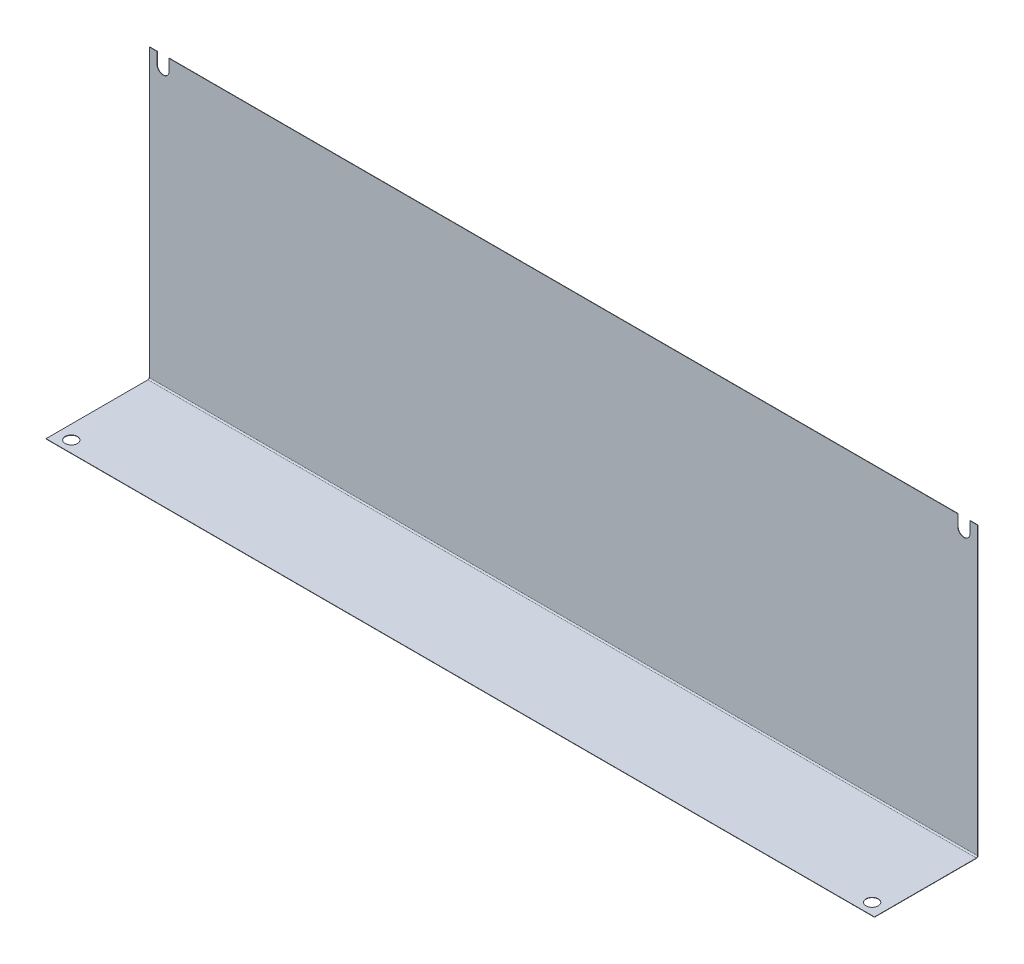
ISO-10303-21;
HEADER;
FILE_DESCRIPTION(('STEP AP214'),'2;1');
FILE_NAME('part.step','',(''),(''),'','','');
FILE_SCHEMA(('AUTOMOTIVE_DESIGN { 1 0 10303 214 1 1 1 1 }'));
ENDSEC;
DATA;
#1=APPLICATION_CONTEXT('core data for automotive mechanical design processes');
#2=APPLICATION_PROTOCOL_DEFINITION('international standard','automotive_design',2000,#1);
#3=PRODUCT_CONTEXT('',#1,'mechanical');
#4=PRODUCT('Part','Part','',(#3));
#5=PRODUCT_RELATED_PRODUCT_CATEGORY('part','',(#4));
#6=PRODUCT_DEFINITION_FORMATION('','',#4);
#7=PRODUCT_DEFINITION_CONTEXT('part definition',#1,'design');
#8=PRODUCT_DEFINITION('design','',#6,#7);
#9=PRODUCT_DEFINITION_SHAPE('','',#8);
#10=(LENGTH_UNIT() NAMED_UNIT(*) SI_UNIT(.MILLI.,.METRE.));
#11=(NAMED_UNIT(*) PLANE_ANGLE_UNIT() SI_UNIT($,.RADIAN.));
#12=(NAMED_UNIT(*) SI_UNIT($,.STERADIAN.) SOLID_ANGLE_UNIT());
#13=UNCERTAINTY_MEASURE_WITH_UNIT(LENGTH_MEASURE(1.E-05),#10,'distance_accuracy_value','');
#14=(GEOMETRIC_REPRESENTATION_CONTEXT(3) GLOBAL_UNCERTAINTY_ASSIGNED_CONTEXT((#13)) GLOBAL_UNIT_ASSIGNED_CONTEXT((#10,
#11,#12)) REPRESENTATION_CONTEXT('',''));
#15=CARTESIAN_POINT('',(0.,0.,0.));
#16=DIRECTION('',(0.,0.,1.));
#17=DIRECTION('',(1.,0.,0.));
#18=AXIS2_PLACEMENT_3D('',#15,#16,#17);
#19=CARTESIAN_POINT('',(457.2,158.75,-57.1500000000006));
#20=DIRECTION('',(0.,-1.,0.));
#21=DIRECTION('',(0.,0.,-1.));
#22=AXIS2_PLACEMENT_3D('',#19,#20,#21);
#23=PLANE('',#22);
#24=DIRECTION('',(1.,0.,0.));
#25=VECTOR('',#24,1.);
#26=CARTESIAN_POINT('',(0.,158.75,-57.1500000000006));
#27=LINE('',#26,#25);
#28=CARTESIAN_POINT('',(10.922,158.75,-57.1500000000006));
#29=VERTEX_POINT('',#28);
#30=CARTESIAN_POINT('',(446.278,158.75,-57.1500000000006));
#31=VERTEX_POINT('',#30);
#32=EDGE_CURVE('E81',#29,#31,#27,.T.);
#33=ORIENTED_EDGE('',*,*,#32,.F.);
#34=DIRECTION('',(0.,0.,1.));
#35=VECTOR('',#34,1.);
#36=CARTESIAN_POINT('',(10.922,158.75,-57.1500000000006));
#37=LINE('',#36,#35);
#38=CARTESIAN_POINT('',(10.922,158.75,-56.9912500000006));
#39=VERTEX_POINT('',#38);
#40=EDGE_CURVE('E66',#29,#39,#37,.T.);
#41=ORIENTED_EDGE('',*,*,#40,.T.);
#42=DIRECTION('',(-1.,0.,0.));
#43=VECTOR('',#42,1.);
#44=CARTESIAN_POINT('',(457.2,158.75,-56.9912500000006));
#45=LINE('',#44,#43);
#46=CARTESIAN_POINT('',(446.278,158.75,-56.9912500000006));
#47=VERTEX_POINT('',#46);
#48=EDGE_CURVE('E233',#39,#47,#45,.F.);
#49=ORIENTED_EDGE('',*,*,#48,.T.);
#50=DIRECTION('',(0.,0.,-1.));
#51=VECTOR('',#50,1.);
#52=CARTESIAN_POINT('',(446.278,158.75,-57.1500000000006));
#53=LINE('',#52,#51);
#54=EDGE_CURVE('E290',#47,#31,#53,.T.);
#55=ORIENTED_EDGE('',*,*,#54,.T.);
#56=EDGE_LOOP('',(#33,#41,#49,#55));
#57=FACE_BOUND('',#56,.T.);
#58=ADVANCED_FACE('F57',(#57),#23,.F.);
#59=CARTESIAN_POINT('',(452.882,158.75,-57.1500000000006));
#60=VERTEX_POINT('',#59);
#61=CARTESIAN_POINT('',(457.2,158.75,-57.1500000000006));
#62=VERTEX_POINT('',#61);
#63=EDGE_CURVE('E224',#60,#62,#27,.T.);
#64=ORIENTED_EDGE('',*,*,#63,.F.);
#65=DIRECTION('',(0.,0.,1.));
#66=VECTOR('',#65,1.);
#67=CARTESIAN_POINT('',(452.882,158.75,-57.1500000000006));
#68=LINE('',#67,#66);
#69=CARTESIAN_POINT('',(452.882,158.75,-56.9912500000006));
#70=VERTEX_POINT('',#69);
#71=EDGE_CURVE('E295',#60,#70,#68,.T.);
#72=ORIENTED_EDGE('',*,*,#71,.T.);
#73=CARTESIAN_POINT('',(457.2,158.75,-56.9912500000006));
#74=VERTEX_POINT('',#73);
#75=EDGE_CURVE('E234',#70,#74,#45,.F.);
#76=ORIENTED_EDGE('',*,*,#75,.T.);
#77=DIRECTION('',(0.,0.,1.));
#78=VECTOR('',#77,1.);
#79=CARTESIAN_POINT('',(457.2,158.75,-57.1500000000006));
#80=LINE('',#79,#78);
#81=EDGE_CURVE('E220',#62,#74,#80,.T.);
#82=ORIENTED_EDGE('',*,*,#81,.F.);
#83=EDGE_LOOP('',(#64,#72,#76,#82));
#84=FACE_BOUND('',#83,.T.);
#85=ADVANCED_FACE('F316',(#84),#23,.F.);
#86=CARTESIAN_POINT('',(0.,-0.15875,0.));
#87=DIRECTION('',(-1.,0.,0.));
#88=DIRECTION('',(0.,0.,1.));
#89=AXIS2_PLACEMENT_3D('',#86,#87,#88);
#90=PLANE('',#89);
#91=DIRECTION('',(0.,0.,1.));
#92=VECTOR('',#91,1.);
#93=CARTESIAN_POINT('',(0.,0.,0.));
#94=LINE('',#93,#92);
#95=CARTESIAN_POINT('',(0.,0.,-56.25465));
#96=VERTEX_POINT('',#95);
#97=CARTESIAN_POINT('',(0.,0.,0.));
#98=VERTEX_POINT('',#97);
#99=EDGE_CURVE('E269',#96,#98,#94,.T.);
#100=ORIENTED_EDGE('',*,*,#99,.F.);
#101=DIRECTION('',(0.,-1.,0.));
#102=VECTOR('',#101,1.);
#103=CARTESIAN_POINT('',(0.,0.,-56.25465));
#104=LINE('',#103,#102);
#105=CARTESIAN_POINT('',(0.,-0.158749999999981,-56.25465));
#106=VERTEX_POINT('',#105);
#107=EDGE_CURVE('E256',#96,#106,#104,.T.);
#108=ORIENTED_EDGE('',*,*,#107,.T.);
#109=DIRECTION('',(0.,0.,1.));
#110=VECTOR('',#109,1.);
#111=CARTESIAN_POINT('',(0.,-0.15875,0.));
#112=LINE('',#111,#110);
#113=CARTESIAN_POINT('',(0.,-0.15875,0.));
#114=VERTEX_POINT('',#113);
#115=EDGE_CURVE('E272',#106,#114,#112,.T.);
#116=ORIENTED_EDGE('',*,*,#115,.T.);
#117=DIRECTION('',(0.,1.,0.));
#118=VECTOR('',#117,1.);
#119=CARTESIAN_POINT('',(0.,-0.15875,0.));
#120=LINE('',#119,#118);
#121=EDGE_CURVE('E281',#114,#98,#120,.T.);
#122=ORIENTED_EDGE('',*,*,#121,.T.);
#123=EDGE_LOOP('',(#100,#108,#116,#122));
#124=FACE_BOUND('',#123,.T.);
#125=ADVANCED_FACE('F59',(#124),#90,.T.);
#126=CARTESIAN_POINT('',(0.,-0.15875,0.));
#127=DIRECTION('',(0.,-1.,0.));
#128=DIRECTION('',(0.,0.,-1.));
#129=AXIS2_PLACEMENT_3D('',#126,#127,#128);
#130=PLANE('',#129);
#131=CARTESIAN_POINT('',(7.62,-0.158750000000018,-6.35));
#132=DIRECTION('',(0.,-1.,0.));
#133=DIRECTION('',(0.,0.,-1.));
#134=AXIS2_PLACEMENT_3D('',#131,#132,#133);
#135=CIRCLE('',#134,3.37819999999999);
#136=CARTESIAN_POINT('',(7.62,-0.158750000000018,-9.72819999999999));
#137=VERTEX_POINT('',#136);
#138=EDGE_CURVE('E552',#137,#137,#135,.T.);
#139=ORIENTED_EDGE('',*,*,#138,.F.);
#140=EDGE_LOOP('',(#139));
#141=FACE_BOUND('',#140,.T.);
#142=CARTESIAN_POINT('',(449.58,-0.158750000000001,-6.35));
#143=DIRECTION('',(0.,-1.,0.));
#144=DIRECTION('',(0.,0.,-1.));
#145=AXIS2_PLACEMENT_3D('',#142,#143,#144);
#146=CIRCLE('',#145,3.3782);
#147=CARTESIAN_POINT('',(449.58,-0.158750000000001,-9.7282));
#148=VERTEX_POINT('',#147);
#149=EDGE_CURVE('E554',#148,#148,#146,.T.);
#150=ORIENTED_EDGE('',*,*,#149,.F.);
#151=EDGE_LOOP('',(#150));
#152=FACE_BOUND('',#151,.T.);
#153=ORIENTED_EDGE('',*,*,#115,.F.);
#154=DIRECTION('',(-1.,0.,0.));
#155=VECTOR('',#154,1.);
#156=CARTESIAN_POINT('',(0.,-0.158749999999981,-56.25465));
#157=LINE('',#156,#155);
#158=CARTESIAN_POINT('',(457.2,-0.15875,-56.25465));
#159=VERTEX_POINT('',#158);
#160=EDGE_CURVE('E249',#106,#159,#157,.F.);
#161=ORIENTED_EDGE('',*,*,#160,.T.);
#162=DIRECTION('',(0.,0.,-1.));
#163=VECTOR('',#162,1.);
#164=CARTESIAN_POINT('',(457.2,-0.15875,0.));
#165=LINE('',#164,#163);
#166=CARTESIAN_POINT('',(457.2,-0.15875,0.));
#167=VERTEX_POINT('',#166);
#168=EDGE_CURVE('E278',#167,#159,#165,.T.);
#169=ORIENTED_EDGE('',*,*,#168,.F.);
#170=DIRECTION('',(1.,0.,0.));
#171=VECTOR('',#170,1.);
#172=CARTESIAN_POINT('',(0.,-0.15875,0.));
#173=LINE('',#172,#171);
#174=EDGE_CURVE('E274',#114,#167,#173,.T.);
#175=ORIENTED_EDGE('',*,*,#174,.F.);
#176=EDGE_LOOP('',(#153,#161,#169,#175));
#177=FACE_BOUND('',#176,.T.);
#178=ADVANCED_FACE('F348',(#141,#152,#177),#130,.T.);
#179=CARTESIAN_POINT('',(0.,0.,0.));
#180=DIRECTION('',(0.,-1.,0.));
#181=DIRECTION('',(0.,0.,-1.));
#182=AXIS2_PLACEMENT_3D('',#179,#180,#181);
#183=PLANE('',#182);
#184=CARTESIAN_POINT('',(7.62,0.,-6.35));
#185=DIRECTION('',(0.,-1.,0.));
#186=DIRECTION('',(0.,0.,-1.));
#187=AXIS2_PLACEMENT_3D('',#184,#185,#186);
#188=CIRCLE('',#187,3.37819999999999);
#189=CARTESIAN_POINT('',(7.62,0.,-9.72819999999999));
#190=VERTEX_POINT('',#189);
#191=EDGE_CURVE('E61',#190,#190,#188,.T.);
#192=ORIENTED_EDGE('',*,*,#191,.T.);
#193=EDGE_LOOP('',(#192));
#194=FACE_BOUND('',#193,.T.);
#195=CARTESIAN_POINT('',(449.58,0.,-6.35));
#196=DIRECTION('',(0.,-1.,0.));
#197=DIRECTION('',(0.,0.,-1.));
#198=AXIS2_PLACEMENT_3D('',#195,#196,#197);
#199=CIRCLE('',#198,3.3782);
#200=CARTESIAN_POINT('',(449.58,0.,-9.7282));
#201=VERTEX_POINT('',#200);
#202=EDGE_CURVE('E185',#201,#201,#199,.T.);
#203=ORIENTED_EDGE('',*,*,#202,.T.);
#204=EDGE_LOOP('',(#203));
#205=FACE_BOUND('',#204,.T.);
#206=DIRECTION('',(-1.,0.,0.));
#207=VECTOR('',#206,1.);
#208=CARTESIAN_POINT('',(0.,0.,-56.25465));
#209=LINE('',#208,#207);
#210=CARTESIAN_POINT('',(457.2,0.,-56.25465));
#211=VERTEX_POINT('',#210);
#212=EDGE_CURVE('E262',#96,#211,#209,.F.);
#213=ORIENTED_EDGE('',*,*,#212,.F.);
#214=ORIENTED_EDGE('',*,*,#99,.T.);
#215=DIRECTION('',(1.,0.,0.));
#216=VECTOR('',#215,1.);
#217=CARTESIAN_POINT('',(0.,0.,0.));
#218=LINE('',#217,#216);
#219=CARTESIAN_POINT('',(457.2,0.,0.));
#220=VERTEX_POINT('',#219);
#221=EDGE_CURVE('E283',#98,#220,#218,.T.);
#222=ORIENTED_EDGE('',*,*,#221,.T.);
#223=DIRECTION('',(0.,0.,-1.));
#224=VECTOR('',#223,1.);
#225=CARTESIAN_POINT('',(457.2,0.,0.));
#226=LINE('',#225,#224);
#227=EDGE_CURVE('E275',#220,#211,#226,.T.);
#228=ORIENTED_EDGE('',*,*,#227,.T.);
#229=EDGE_LOOP('',(#213,#214,#222,#228));
#230=FACE_BOUND('',#229,.T.);
#231=ADVANCED_FACE('F358',(#194,#205,#230),#183,.F.);
#232=CARTESIAN_POINT('',(457.2,-0.15875,0.));
#233=DIRECTION('',(1.,0.,0.));
#234=DIRECTION('',(0.,0.,-1.));
#235=AXIS2_PLACEMENT_3D('',#232,#233,#234);
#236=PLANE('',#235);
#237=DIRECTION('',(0.,-1.,0.));
#238=VECTOR('',#237,1.);
#239=CARTESIAN_POINT('',(457.2,0.,-56.25465));
#240=LINE('',#239,#238);
#241=EDGE_CURVE('E266',#211,#159,#240,.T.);
#242=ORIENTED_EDGE('',*,*,#241,.F.);
#243=ORIENTED_EDGE('',*,*,#227,.F.);
#244=DIRECTION('',(0.,1.,0.));
#245=VECTOR('',#244,1.);
#246=CARTESIAN_POINT('',(457.2,-0.15875,0.));
#247=LINE('',#246,#245);
#248=EDGE_CURVE('E288',#167,#220,#247,.T.);
#249=ORIENTED_EDGE('',*,*,#248,.F.);
#250=ORIENTED_EDGE('',*,*,#168,.T.);
#251=EDGE_LOOP('',(#242,#243,#249,#250));
#252=FACE_BOUND('',#251,.T.);
#253=ADVANCED_FACE('F350',(#252),#236,.T.);
#254=CARTESIAN_POINT('',(0.,-0.15875,0.));
#255=DIRECTION('',(0.,0.,1.));
#256=DIRECTION('',(1.,0.,0.));
#257=AXIS2_PLACEMENT_3D('',#254,#255,#256);
#258=PLANE('',#257);
#259=ORIENTED_EDGE('',*,*,#221,.F.);
#260=ORIENTED_EDGE('',*,*,#121,.F.);
#261=ORIENTED_EDGE('',*,*,#174,.T.);
#262=ORIENTED_EDGE('',*,*,#248,.T.);
#263=EDGE_LOOP('',(#259,#260,#261,#262));
#264=FACE_BOUND('',#263,.T.);
#265=ADVANCED_FACE('F353',(#264),#258,.T.);
#266=CARTESIAN_POINT('',(457.2,0.736599999999982,-56.25465));
#267=DIRECTION('',(1.,0.,0.));
#268=DIRECTION('',(0.,1.,0.));
#269=AXIS2_PLACEMENT_3D('',#266,#267,#268);
#270=PLANE('',#269);
#271=DIRECTION('',(0.,0.,1.));
#272=VECTOR('',#271,1.);
#273=CARTESIAN_POINT('',(457.2,0.736599999999998,-57.15));
#274=LINE('',#273,#272);
#275=CARTESIAN_POINT('',(457.2,0.736599999999979,-56.99125));
#276=VERTEX_POINT('',#275);
#277=CARTESIAN_POINT('',(457.2,0.736599999999979,-57.15));
#278=VERTEX_POINT('',#277);
#279=EDGE_CURVE('E215',#276,#278,#274,.F.);
#280=ORIENTED_EDGE('',*,*,#279,.F.);
#281=CARTESIAN_POINT('',(457.2,0.736599999999982,-56.25465));
#282=DIRECTION('',(-1.,0.,0.));
#283=DIRECTION('',(0.,-1.,0.));
#284=AXIS2_PLACEMENT_3D('',#281,#282,#283);
#285=CIRCLE('',#284,0.736599999999997);
#286=EDGE_CURVE('E259',#211,#276,#285,.F.);
#287=ORIENTED_EDGE('',*,*,#286,.F.);
#288=ORIENTED_EDGE('',*,*,#241,.T.);
#289=CARTESIAN_POINT('',(457.2,0.736599999999982,-56.25465));
#290=DIRECTION('',(-1.,0.,0.));
#291=DIRECTION('',(0.,-1.,0.));
#292=AXIS2_PLACEMENT_3D('',#289,#290,#291);
#293=CIRCLE('',#292,0.895349999999997);
#294=EDGE_CURVE('E252',#159,#278,#293,.F.);
#295=ORIENTED_EDGE('',*,*,#294,.T.);
#296=EDGE_LOOP('',(#280,#287,#288,#295));
#297=FACE_BOUND('',#296,.T.);
#298=ADVANCED_FACE('F341',(#297),#270,.T.);
#299=CARTESIAN_POINT('',(0.,0.736600000000016,-56.25465));
#300=DIRECTION('',(1.,0.,0.));
#301=DIRECTION('',(0.,1.,0.));
#302=AXIS2_PLACEMENT_3D('',#299,#300,#301);
#303=PLANE('',#302);
#304=CARTESIAN_POINT('',(0.,0.736600000000016,-56.25465));
#305=DIRECTION('',(-1.,0.,0.));
#306=DIRECTION('',(0.,-1.,0.));
#307=AXIS2_PLACEMENT_3D('',#304,#305,#306);
#308=CIRCLE('',#307,0.736599999999997);
#309=CARTESIAN_POINT('',(0.,0.736600000000013,-56.99125));
#310=VERTEX_POINT('',#309);
#311=EDGE_CURVE('E219',#310,#96,#308,.T.);
#312=ORIENTED_EDGE('',*,*,#311,.F.);
#313=DIRECTION('',(0.,0.,1.));
#314=VECTOR('',#313,1.);
#315=CARTESIAN_POINT('',(0.,0.736600000000011,-56.99125));
#316=LINE('',#315,#314);
#317=CARTESIAN_POINT('',(0.,0.736600000000012,-57.15));
#318=VERTEX_POINT('',#317);
#319=EDGE_CURVE('E242',#310,#318,#316,.F.);
#320=ORIENTED_EDGE('',*,*,#319,.T.);
#321=CARTESIAN_POINT('',(0.,0.736600000000016,-56.25465));
#322=DIRECTION('',(-1.,0.,0.));
#323=DIRECTION('',(0.,-1.,0.));
#324=AXIS2_PLACEMENT_3D('',#321,#322,#323);
#325=CIRCLE('',#324,0.895349999999997);
#326=EDGE_CURVE('E253',#318,#106,#325,.T.);
#327=ORIENTED_EDGE('',*,*,#326,.T.);
#328=ORIENTED_EDGE('',*,*,#107,.F.);
#329=EDGE_LOOP('',(#312,#320,#327,#328));
#330=FACE_BOUND('',#329,.T.);
#331=ADVANCED_FACE('F332',(#330),#303,.F.);
#332=CARTESIAN_POINT('',(0.,0.736600000000016,-56.25465));
#333=DIRECTION('',(-1.,0.,0.));
#334=DIRECTION('',(0.,0.,-1.));
#335=AXIS2_PLACEMENT_3D('',#332,#333,#334);
#336=CYLINDRICAL_SURFACE('',#335,0.895349999999997);
#337=ORIENTED_EDGE('',*,*,#160,.F.);
#338=ORIENTED_EDGE('',*,*,#326,.F.);
#339=DIRECTION('',(-1.,0.,0.));
#340=VECTOR('',#339,1.);
#341=CARTESIAN_POINT('',(457.2,0.736599999999998,-57.15));
#342=LINE('',#341,#340);
#343=EDGE_CURVE('E240',#318,#278,#342,.F.);
#344=ORIENTED_EDGE('',*,*,#343,.T.);
#345=ORIENTED_EDGE('',*,*,#294,.F.);
#346=EDGE_LOOP('',(#337,#338,#344,#345));
#347=FACE_BOUND('',#346,.T.);
#348=ADVANCED_FACE('F339',(#347),#336,.T.);
#349=CARTESIAN_POINT('',(0.,0.736600000000016,-56.25465));
#350=DIRECTION('',(-1.,0.,0.));
#351=DIRECTION('',(0.,0.,-1.));
#352=AXIS2_PLACEMENT_3D('',#349,#350,#351);
#353=CYLINDRICAL_SURFACE('',#352,0.736599999999997);
#354=ORIENTED_EDGE('',*,*,#212,.T.);
#355=ORIENTED_EDGE('',*,*,#286,.T.);
#356=DIRECTION('',(-1.,0.,0.));
#357=VECTOR('',#356,1.);
#358=CARTESIAN_POINT('',(457.2,0.736599999999997,-56.99125));
#359=LINE('',#358,#357);
#360=EDGE_CURVE('E245',#276,#310,#359,.T.);
#361=ORIENTED_EDGE('',*,*,#360,.T.);
#362=ORIENTED_EDGE('',*,*,#311,.T.);
#363=EDGE_LOOP('',(#354,#355,#361,#362));
#364=FACE_BOUND('',#363,.T.);
#365=ADVANCED_FACE('F327',(#364),#353,.F.);
#366=CARTESIAN_POINT('',(457.2,0.,-57.15));
#367=DIRECTION('',(-1.,0.,0.));
#368=DIRECTION('',(0.,0.,1.));
#369=AXIS2_PLACEMENT_3D('',#366,#367,#368);
#370=PLANE('',#369);
#371=ORIENTED_EDGE('',*,*,#279,.T.);
#372=DIRECTION('',(0.,-1.,0.));
#373=VECTOR('',#372,1.);
#374=CARTESIAN_POINT('',(457.2,-2.0039441709507E-13,-57.15));
#375=LINE('',#374,#373);
#376=EDGE_CURVE('E227',#62,#278,#375,.T.);
#377=ORIENTED_EDGE('',*,*,#376,.F.);
#378=ORIENTED_EDGE('',*,*,#81,.T.);
#379=DIRECTION('',(0.,1.,0.));
#380=VECTOR('',#379,1.);
#381=CARTESIAN_POINT('',(457.2,0.,-56.99125));
#382=LINE('',#381,#380);
#383=EDGE_CURVE('E237',#74,#276,#382,.F.);
#384=ORIENTED_EDGE('',*,*,#383,.T.);
#385=EDGE_LOOP('',(#371,#377,#378,#384));
#386=FACE_BOUND('',#385,.T.);
#387=ADVANCED_FACE('F321',(#386),#370,.F.);
#388=CARTESIAN_POINT('',(0.,158.75,-57.1500000000006));
#389=DIRECTION('',(1.,0.,0.));
#390=DIRECTION('',(0.,0.,-1.));
#391=AXIS2_PLACEMENT_3D('',#388,#389,#390);
#392=PLANE('',#391);
#393=ORIENTED_EDGE('',*,*,#319,.F.);
#394=DIRECTION('',(0.,-1.,0.));
#395=VECTOR('',#394,1.);
#396=CARTESIAN_POINT('',(0.,158.75,-56.9912500000006));
#397=LINE('',#396,#395);
#398=CARTESIAN_POINT('',(0.,158.75,-56.9912500000006));
#399=VERTEX_POINT('',#398);
#400=EDGE_CURVE('E235',#310,#399,#397,.F.);
#401=ORIENTED_EDGE('',*,*,#400,.T.);
#402=DIRECTION('',(0.,0.,1.));
#403=VECTOR('',#402,1.);
#404=CARTESIAN_POINT('',(0.,158.75,-57.1500000000006));
#405=LINE('',#404,#403);
#406=CARTESIAN_POINT('',(0.,158.75,-57.1500000000006));
#407=VERTEX_POINT('',#406);
#408=EDGE_CURVE('E216',#407,#399,#405,.T.);
#409=ORIENTED_EDGE('',*,*,#408,.F.);
#410=DIRECTION('',(0.,1.,0.));
#411=VECTOR('',#410,1.);
#412=CARTESIAN_POINT('',(0.,-2.0039441709507E-13,-57.15));
#413=LINE('',#412,#411);
#414=EDGE_CURVE('E225',#318,#407,#413,.T.);
#415=ORIENTED_EDGE('',*,*,#414,.F.);
#416=EDGE_LOOP('',(#393,#401,#409,#415));
#417=FACE_BOUND('',#416,.T.);
#418=ADVANCED_FACE('F336',(#417),#392,.F.);
#419=CARTESIAN_POINT('',(0.,-2.0039441709507E-13,-57.15));
#420=DIRECTION('',(0.,0.,1.));
#421=DIRECTION('',(0.,-1.,0.));
#422=AXIS2_PLACEMENT_3D('',#419,#420,#421);
#423=PLANE('',#422);
#424=CARTESIAN_POINT('',(7.62,152.4,-57.1500000000005));
#425=DIRECTION('',(0.,0.,-1.));
#426=DIRECTION('',(0.,1.,0.));
#427=AXIS2_PLACEMENT_3D('',#424,#425,#426);
#428=CIRCLE('',#427,3.302);
#429=CARTESIAN_POINT('',(10.922,152.4,-57.1500000000005));
#430=VERTEX_POINT('',#429);
#431=CARTESIAN_POINT('',(4.318,152.4,-57.1500000000005));
#432=VERTEX_POINT('',#431);
#433=EDGE_CURVE('E181',#430,#432,#428,.T.);
#434=ORIENTED_EDGE('',*,*,#433,.F.);
#435=DIRECTION('',(0.,-1.,0.));
#436=VECTOR('',#435,1.);
#437=CARTESIAN_POINT('',(10.922,152.4,-57.1500000000005));
#438=LINE('',#437,#436);
#439=EDGE_CURVE('E178',#29,#430,#438,.T.);
#440=ORIENTED_EDGE('',*,*,#439,.F.);
#441=ORIENTED_EDGE('',*,*,#32,.T.);
#442=DIRECTION('',(0.,1.,0.));
#443=VECTOR('',#442,1.);
#444=CARTESIAN_POINT('',(446.278,152.4,-57.1500000000005));
#445=LINE('',#444,#443);
#446=CARTESIAN_POINT('',(446.278,152.4,-57.1500000000005));
#447=VERTEX_POINT('',#446);
#448=EDGE_CURVE('E202',#447,#31,#445,.T.);
#449=ORIENTED_EDGE('',*,*,#448,.F.);
#450=CARTESIAN_POINT('',(449.58,152.4,-57.1500000000005));
#451=DIRECTION('',(0.,0.,-1.));
#452=DIRECTION('',(0.,1.,0.));
#453=AXIS2_PLACEMENT_3D('',#450,#451,#452);
#454=CIRCLE('',#453,3.30200000000005);
#455=CARTESIAN_POINT('',(452.882,152.4,-57.1500000000005));
#456=VERTEX_POINT('',#455);
#457=EDGE_CURVE('E199',#456,#447,#454,.T.);
#458=ORIENTED_EDGE('',*,*,#457,.F.);
#459=DIRECTION('',(0.,-1.,0.));
#460=VECTOR('',#459,1.);
#461=CARTESIAN_POINT('',(452.882,152.4,-57.1500000000005));
#462=LINE('',#461,#460);
#463=EDGE_CURVE('E204',#60,#456,#462,.T.);
#464=ORIENTED_EDGE('',*,*,#463,.F.);
#465=ORIENTED_EDGE('',*,*,#63,.T.);
#466=ORIENTED_EDGE('',*,*,#376,.T.);
#467=ORIENTED_EDGE('',*,*,#343,.F.);
#468=ORIENTED_EDGE('',*,*,#414,.T.);
#469=CARTESIAN_POINT('',(4.31799999999999,158.75,-57.1500000000006));
#470=VERTEX_POINT('',#469);
#471=EDGE_CURVE('E190',#407,#470,#27,.T.);
#472=ORIENTED_EDGE('',*,*,#471,.T.);
#473=DIRECTION('',(0.,1.,0.));
#474=VECTOR('',#473,1.);
#475=CARTESIAN_POINT('',(4.318,158.75,-57.1500000000006));
#476=LINE('',#475,#474);
#477=EDGE_CURVE('E73',#432,#470,#476,.T.);
#478=ORIENTED_EDGE('',*,*,#477,.F.);
#479=EDGE_LOOP('',(#434,#440,#441,#449,#458,#464,#465,#466,#467,#468,#472,#478));
#480=FACE_BOUND('',#479,.T.);
#481=ADVANCED_FACE('F188',(#480),#423,.F.);
#482=CARTESIAN_POINT('',(0.,-1.99840144432528E-13,-56.99125));
#483=DIRECTION('',(0.,0.,1.));
#484=DIRECTION('',(0.,-1.,0.));
#485=AXIS2_PLACEMENT_3D('',#482,#483,#484);
#486=PLANE('',#485);
#487=DIRECTION('',(0.,1.,0.));
#488=VECTOR('',#487,1.);
#489=CARTESIAN_POINT('',(10.922,-1.99840144432528E-13,-56.99125));
#490=LINE('',#489,#488);
#491=CARTESIAN_POINT('',(10.922,152.4,-56.9912500000005));
#492=VERTEX_POINT('',#491);
#493=EDGE_CURVE('E197',#492,#39,#490,.T.);
#494=ORIENTED_EDGE('',*,*,#493,.F.);
#495=CARTESIAN_POINT('',(7.62,152.4,-56.9912500000005));
#496=DIRECTION('',(0.,0.,1.));
#497=DIRECTION('',(0.,-1.,0.));
#498=AXIS2_PLACEMENT_3D('',#495,#496,#497);
#499=CIRCLE('',#498,3.302);
#500=CARTESIAN_POINT('',(4.318,152.4,-56.9912500000005));
#501=VERTEX_POINT('',#500);
#502=EDGE_CURVE('E13',#501,#492,#499,.T.);
#503=ORIENTED_EDGE('',*,*,#502,.F.);
#504=DIRECTION('',(0.,-1.,0.));
#505=VECTOR('',#504,1.);
#506=CARTESIAN_POINT('',(4.318,-1.99840144432528E-13,-56.99125));
#507=LINE('',#506,#505);
#508=CARTESIAN_POINT('',(4.318,158.75,-56.9912500000006));
#509=VERTEX_POINT('',#508);
#510=EDGE_CURVE('E174',#509,#501,#507,.T.);
#511=ORIENTED_EDGE('',*,*,#510,.F.);
#512=EDGE_CURVE('E230',#399,#509,#45,.F.);
#513=ORIENTED_EDGE('',*,*,#512,.F.);
#514=ORIENTED_EDGE('',*,*,#400,.F.);
#515=ORIENTED_EDGE('',*,*,#360,.F.);
#516=ORIENTED_EDGE('',*,*,#383,.F.);
#517=ORIENTED_EDGE('',*,*,#75,.F.);
#518=DIRECTION('',(0.,1.,0.));
#519=VECTOR('',#518,1.);
#520=CARTESIAN_POINT('',(452.882000000001,3.7592151613808E-12,-56.99125));
#521=LINE('',#520,#519);
#522=CARTESIAN_POINT('',(452.882,152.4,-56.9912500000005));
#523=VERTEX_POINT('',#522);
#524=EDGE_CURVE('E213',#523,#70,#521,.T.);
#525=ORIENTED_EDGE('',*,*,#524,.F.);
#526=CARTESIAN_POINT('',(449.58,152.4,-56.9912500000005));
#527=DIRECTION('',(0.,0.,1.));
#528=DIRECTION('',(0.,-1.,0.));
#529=AXIS2_PLACEMENT_3D('',#526,#527,#528);
#530=CIRCLE('',#529,3.30200000000005);
#531=CARTESIAN_POINT('',(446.278,152.4,-56.9912500000005));
#532=VERTEX_POINT('',#531);
#533=EDGE_CURVE('E298',#532,#523,#530,.T.);
#534=ORIENTED_EDGE('',*,*,#533,.F.);
#535=DIRECTION('',(0.,-1.,0.));
#536=VECTOR('',#535,1.);
#537=CARTESIAN_POINT('',(446.278,-1.99840144432528E-13,-56.99125));
#538=LINE('',#537,#536);
#539=EDGE_CURVE('E210',#47,#532,#538,.T.);
#540=ORIENTED_EDGE('',*,*,#539,.F.);
#541=ORIENTED_EDGE('',*,*,#48,.F.);
#542=EDGE_LOOP('',(#494,#503,#511,#513,#514,#515,#516,#517,#525,#534,#540,#541));
#543=FACE_BOUND('',#542,.T.);
#544=ADVANCED_FACE('F310',(#543),#486,.T.);
#545=ORIENTED_EDGE('',*,*,#512,.T.);
#546=DIRECTION('',(0.,0.,-1.));
#547=VECTOR('',#546,1.);
#548=CARTESIAN_POINT('',(4.31799999999999,158.75,-57.1500000000006));
#549=LINE('',#548,#547);
#550=EDGE_CURVE('E300',#509,#470,#549,.T.);
#551=ORIENTED_EDGE('',*,*,#550,.T.);
#552=ORIENTED_EDGE('',*,*,#471,.F.);
#553=ORIENTED_EDGE('',*,*,#408,.T.);
#554=EDGE_LOOP('',(#545,#551,#552,#553));
#555=FACE_BOUND('',#554,.T.);
#556=ADVANCED_FACE('F373',(#555),#23,.F.);
#557=CARTESIAN_POINT('',(449.58,152.4,0.));
#558=DIRECTION('',(0.,0.,-1.));
#559=DIRECTION('',(0.,1.,0.));
#560=AXIS2_PLACEMENT_3D('',#557,#558,#559);
#561=CYLINDRICAL_SURFACE('',#560,3.30200000000005);
#562=ORIENTED_EDGE('',*,*,#533,.T.);
#563=DIRECTION('',(0.,0.,-1.));
#564=VECTOR('',#563,1.);
#565=CARTESIAN_POINT('',(452.882,152.4,0.));
#566=LINE('',#565,#564);
#567=EDGE_CURVE('E208',#523,#456,#566,.T.);
#568=ORIENTED_EDGE('',*,*,#567,.T.);
#569=ORIENTED_EDGE('',*,*,#457,.T.);
#570=DIRECTION('',(0.,0.,-1.));
#571=VECTOR('',#570,1.);
#572=CARTESIAN_POINT('',(446.278,152.4,0.));
#573=LINE('',#572,#571);
#574=EDGE_CURVE('E207',#532,#447,#573,.T.);
#575=ORIENTED_EDGE('',*,*,#574,.F.);
#576=EDGE_LOOP('',(#562,#568,#569,#575));
#577=FACE_BOUND('',#576,.T.);
#578=ADVANCED_FACE('F380',(#577),#561,.F.);
#579=CARTESIAN_POINT('',(452.882,152.4,0.));
#580=DIRECTION('',(1.,0.,0.));
#581=DIRECTION('',(0.,1.,0.));
#582=AXIS2_PLACEMENT_3D('',#579,#580,#581);
#583=PLANE('',#582);
#584=ORIENTED_EDGE('',*,*,#524,.T.);
#585=ORIENTED_EDGE('',*,*,#71,.F.);
#586=ORIENTED_EDGE('',*,*,#463,.T.);
#587=ORIENTED_EDGE('',*,*,#567,.F.);
#588=EDGE_LOOP('',(#584,#585,#586,#587));
#589=FACE_BOUND('',#588,.T.);
#590=ADVANCED_FACE('F386',(#589),#583,.F.);
#591=CARTESIAN_POINT('',(446.278,152.4,0.));
#592=DIRECTION('',(-1.,0.,0.));
#593=DIRECTION('',(0.,0.,1.));
#594=AXIS2_PLACEMENT_3D('',#591,#592,#593);
#595=PLANE('',#594);
#596=ORIENTED_EDGE('',*,*,#539,.T.);
#597=ORIENTED_EDGE('',*,*,#574,.T.);
#598=ORIENTED_EDGE('',*,*,#448,.T.);
#599=ORIENTED_EDGE('',*,*,#54,.F.);
#600=EDGE_LOOP('',(#596,#597,#598,#599));
#601=FACE_BOUND('',#600,.T.);
#602=ADVANCED_FACE('F398',(#601),#595,.F.);
#603=CARTESIAN_POINT('',(7.62,152.4,0.));
#604=DIRECTION('',(0.,0.,-1.));
#605=DIRECTION('',(0.,1.,0.));
#606=AXIS2_PLACEMENT_3D('',#603,#604,#605);
#607=CYLINDRICAL_SURFACE('',#606,3.302);
#608=ORIENTED_EDGE('',*,*,#502,.T.);
#609=DIRECTION('',(0.,0.,-1.));
#610=VECTOR('',#609,1.);
#611=CARTESIAN_POINT('',(10.922,152.4,0.));
#612=LINE('',#611,#610);
#613=EDGE_CURVE('E177',#492,#430,#612,.T.);
#614=ORIENTED_EDGE('',*,*,#613,.T.);
#615=ORIENTED_EDGE('',*,*,#433,.T.);
#616=DIRECTION('',(0.,0.,-1.));
#617=VECTOR('',#616,1.);
#618=CARTESIAN_POINT('',(4.318,152.4,0.));
#619=LINE('',#618,#617);
#620=EDGE_CURVE('E170',#501,#432,#619,.T.);
#621=ORIENTED_EDGE('',*,*,#620,.F.);
#622=EDGE_LOOP('',(#608,#614,#615,#621));
#623=FACE_BOUND('',#622,.T.);
#624=ADVANCED_FACE('F182',(#623),#607,.F.);
#625=CARTESIAN_POINT('',(10.922,152.4,0.));
#626=DIRECTION('',(1.,0.,0.));
#627=DIRECTION('',(0.,0.,-1.));
#628=AXIS2_PLACEMENT_3D('',#625,#626,#627);
#629=PLANE('',#628);
#630=ORIENTED_EDGE('',*,*,#493,.T.);
#631=ORIENTED_EDGE('',*,*,#40,.F.);
#632=ORIENTED_EDGE('',*,*,#439,.T.);
#633=ORIENTED_EDGE('',*,*,#613,.F.);
#634=EDGE_LOOP('',(#630,#631,#632,#633));
#635=FACE_BOUND('',#634,.T.);
#636=ADVANCED_FACE('F389',(#635),#629,.F.);
#637=CARTESIAN_POINT('',(4.318,158.75,0.));
#638=DIRECTION('',(-1.,0.,0.));
#639=DIRECTION('',(0.,0.,1.));
#640=AXIS2_PLACEMENT_3D('',#637,#638,#639);
#641=PLANE('',#640);
#642=ORIENTED_EDGE('',*,*,#510,.T.);
#643=ORIENTED_EDGE('',*,*,#620,.T.);
#644=ORIENTED_EDGE('',*,*,#477,.T.);
#645=ORIENTED_EDGE('',*,*,#550,.F.);
#646=EDGE_LOOP('',(#642,#643,#644,#645));
#647=FACE_BOUND('',#646,.T.);
#648=ADVANCED_FACE('F172',(#647),#641,.F.);
#649=CARTESIAN_POINT('',(449.58,-0.15875,-6.35));
#650=DIRECTION('',(0.,-1.,0.));
#651=DIRECTION('',(0.,0.,-1.));
#652=AXIS2_PLACEMENT_3D('',#649,#650,#651);
#653=CYLINDRICAL_SURFACE('',#652,3.3782);
#654=ORIENTED_EDGE('',*,*,#149,.T.);
#655=EDGE_LOOP('',(#654));
#656=FACE_BOUND('',#655,.T.);
#657=ORIENTED_EDGE('',*,*,#202,.F.);
#658=EDGE_LOOP('',(#657));
#659=FACE_BOUND('',#658,.T.);
#660=ADVANCED_FACE('F396',(#656,#659),#653,.F.);
#661=CARTESIAN_POINT('',(7.62,-0.158750000000017,-6.35));
#662=DIRECTION('',(0.,-1.,0.));
#663=DIRECTION('',(0.,0.,-1.));
#664=AXIS2_PLACEMENT_3D('',#661,#662,#663);
#665=CYLINDRICAL_SURFACE('',#664,3.37819999999999);
#666=ORIENTED_EDGE('',*,*,#138,.T.);
#667=EDGE_LOOP('',(#666));
#668=FACE_BOUND('',#667,.T.);
#669=ORIENTED_EDGE('',*,*,#191,.F.);
#670=EDGE_LOOP('',(#669));
#671=FACE_BOUND('',#670,.T.);
#672=ADVANCED_FACE('F537',(#668,#671),#665,.F.);
#673=CLOSED_SHELL('',(#58,#85,#125,#178,#231,#253,#265,#298,#331,#348,#365,#387,#418,#481,#544,
#556,#578,#590,#602,#624,#636,#648,#660,#672));
#674=MANIFOLD_SOLID_BREP('B2',#673);
#675=ADVANCED_BREP_SHAPE_REPRESENTATION('',(#18,#674),#14);
#676=SHAPE_DEFINITION_REPRESENTATION(#9,#675);
ENDSEC;
END-ISO-10303-21;
